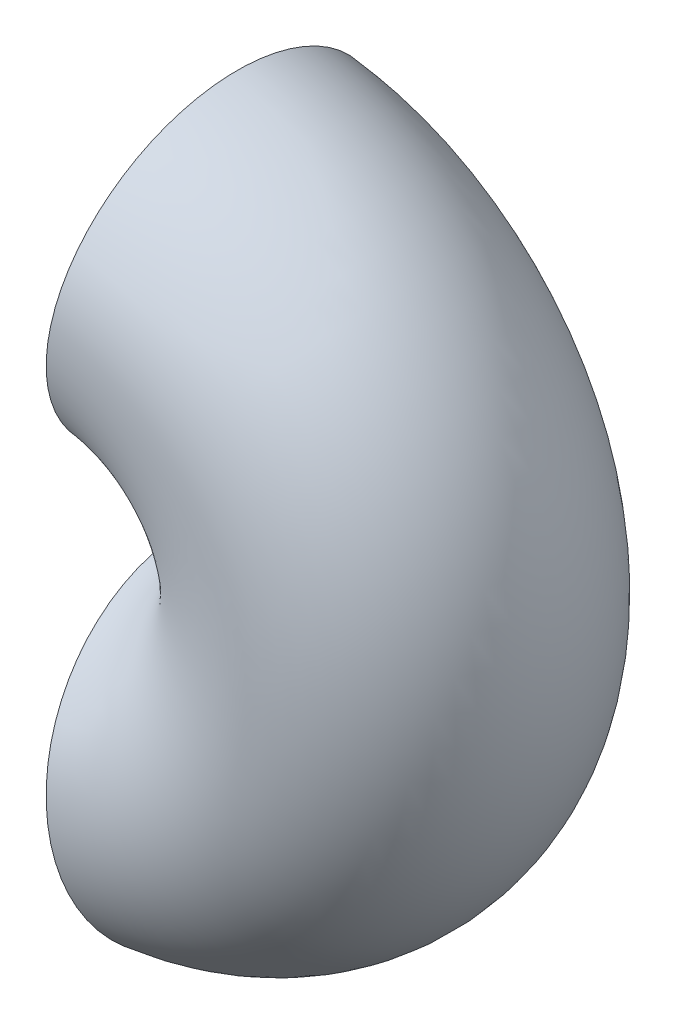
ISO-10303-21;
HEADER;
FILE_DESCRIPTION(('STEP AP214'),'2;1');
FILE_NAME('part.step','',(''),(''),'','','');
FILE_SCHEMA(('AUTOMOTIVE_DESIGN { 1 0 10303 214 1 1 1 1 }'));
ENDSEC;
DATA;
#1=APPLICATION_CONTEXT('core data for automotive mechanical design processes');
#2=APPLICATION_PROTOCOL_DEFINITION('international standard','automotive_design',2000,#1);
#3=PRODUCT_CONTEXT('',#1,'mechanical');
#4=PRODUCT('Part','Part','',(#3));
#5=PRODUCT_RELATED_PRODUCT_CATEGORY('part','',(#4));
#6=PRODUCT_DEFINITION_FORMATION('','',#4);
#7=PRODUCT_DEFINITION_CONTEXT('part definition',#1,'design');
#8=PRODUCT_DEFINITION('design','',#6,#7);
#9=PRODUCT_DEFINITION_SHAPE('','',#8);
#10=(LENGTH_UNIT() NAMED_UNIT(*) SI_UNIT(.MILLI.,.METRE.));
#11=(NAMED_UNIT(*) PLANE_ANGLE_UNIT() SI_UNIT($,.RADIAN.));
#12=(NAMED_UNIT(*) SI_UNIT($,.STERADIAN.) SOLID_ANGLE_UNIT());
#13=UNCERTAINTY_MEASURE_WITH_UNIT(LENGTH_MEASURE(1.E-05),#10,'distance_accuracy_value','');
#14=(GEOMETRIC_REPRESENTATION_CONTEXT(3) GLOBAL_UNCERTAINTY_ASSIGNED_CONTEXT((#13)) GLOBAL_UNIT_ASSIGNED_CONTEXT((#10,
#11,#12)) REPRESENTATION_CONTEXT('',''));
#15=CARTESIAN_POINT('',(0.,0.,0.));
#16=DIRECTION('',(0.,0.,1.));
#17=DIRECTION('',(1.,0.,0.));
#18=AXIS2_PLACEMENT_3D('',#15,#16,#17);
#19=CARTESIAN_POINT('',(-70.,0.,0.));
#20=DIRECTION('',(0.,0.,1.));
#21=DIRECTION('',(1.,0.,0.));
#22=AXIS2_PLACEMENT_3D('',#19,#20,#21);
#23=TOROIDAL_SURFACE('',#22,70.,54.9999999999999);
#24=CARTESIAN_POINT('',(-60.0777871920562,-69.2932153460487,0.));
#25=DIRECTION('',(-0.989903076372124,-0.141745897256341,0.));
#26=DIRECTION('',(0.,0.,-1.));
#27=AXIS2_PLACEMENT_3D('',#24,#25,#26);
#28=CIRCLE('',#27,54.9999999999999);
#29=CARTESIAN_POINT('',(-60.0777871920562,-69.2932153460487,-54.9999999999999));
#30=VERTEX_POINT('',#29);
#31=EDGE_CURVE('E96',#30,#30,#28,.T.);
#32=ORIENTED_EDGE('',*,*,#31,.F.);
#33=EDGE_LOOP('',(#32));
#34=FACE_BOUND('',#33,.T.);
#35=CARTESIAN_POINT('',(-60.0777871920562,69.2932153460487,0.));
#36=DIRECTION('',(0.989903076372124,-0.14174589725634,0.));
#37=DIRECTION('',(0.,0.,-1.));
#38=AXIS2_PLACEMENT_3D('',#35,#36,#37);
#39=CIRCLE('',#38,54.9999999999999);
#40=CARTESIAN_POINT('',(-60.0777871920562,69.2932153460487,-54.9999999999999));
#41=VERTEX_POINT('',#40);
#42=EDGE_CURVE('E12',#41,#41,#39,.T.);
#43=ORIENTED_EDGE('',*,*,#42,.T.);
#44=EDGE_LOOP('',(#43));
#45=FACE_BOUND('',#44,.T.);
#46=ADVANCED_FACE('F83',(#34,#45),#23,.T.);
#47=CARTESIAN_POINT('',(-70.,0.,0.));
#48=DIRECTION('',(0.,0.,1.));
#49=DIRECTION('',(1.,0.,0.));
#50=AXIS2_PLACEMENT_3D('',#47,#48,#49);
#51=TOROIDAL_SURFACE('',#50,70.,44.9999999999999);
#52=CARTESIAN_POINT('',(-60.0777871920562,-69.2932153460487,0.));
#53=DIRECTION('',(-0.989903076372124,-0.141745897256341,0.));
#54=DIRECTION('',(0.,0.,-1.));
#55=AXIS2_PLACEMENT_3D('',#52,#53,#54);
#56=CIRCLE('',#55,44.9999999999999);
#57=CARTESIAN_POINT('',(-60.0777871920562,-69.2932153460487,-44.9999999999999));
#58=VERTEX_POINT('',#57);
#59=EDGE_CURVE('E91',#58,#58,#56,.T.);
#60=ORIENTED_EDGE('',*,*,#59,.T.);
#61=EDGE_LOOP('',(#60));
#62=FACE_BOUND('',#61,.T.);
#63=CARTESIAN_POINT('',(-60.0777871920562,69.2932153460487,0.));
#64=DIRECTION('',(0.989903076372124,-0.14174589725634,0.));
#65=DIRECTION('',(0.,0.,-1.));
#66=AXIS2_PLACEMENT_3D('',#63,#64,#65);
#67=CIRCLE('',#66,44.9999999999999);
#68=CARTESIAN_POINT('',(-60.0777871920562,69.2932153460487,-44.9999999999998));
#69=VERTEX_POINT('',#68);
#70=EDGE_CURVE('E103',#69,#69,#67,.T.);
#71=ORIENTED_EDGE('',*,*,#70,.F.);
#72=EDGE_LOOP('',(#71));
#73=FACE_BOUND('',#72,.T.);
#74=ADVANCED_FACE('F116',(#62,#73),#51,.F.);
#75=CARTESIAN_POINT('',(-53.6992218155209,-113.838853782794,0.));
#76=DIRECTION('',(-0.989903076372124,-0.141745897256341,0.));
#77=DIRECTION('',(0.,0.,-1.));
#78=AXIS2_PLACEMENT_3D('',#75,#76,#77);
#79=PLANE('',#78);
#80=ORIENTED_EDGE('',*,*,#31,.T.);
#81=EDGE_LOOP('',(#80));
#82=FACE_BOUND('',#81,.T.);
#83=ORIENTED_EDGE('',*,*,#59,.F.);
#84=EDGE_LOOP('',(#83));
#85=FACE_BOUND('',#84,.T.);
#86=ADVANCED_FACE('F112',(#82,#85),#79,.T.);
#87=CARTESIAN_POINT('',(-53.6992218155209,113.838853782794,0.));
#88=DIRECTION('',(-0.989903076372124,0.14174589725634,0.));
#89=DIRECTION('',(0.,0.,1.));
#90=AXIS2_PLACEMENT_3D('',#87,#88,#89);
#91=PLANE('',#90);
#92=ORIENTED_EDGE('',*,*,#70,.T.);
#93=EDGE_LOOP('',(#92));
#94=FACE_BOUND('',#93,.T.);
#95=ORIENTED_EDGE('',*,*,#42,.F.);
#96=EDGE_LOOP('',(#95));
#97=FACE_BOUND('',#96,.T.);
#98=ADVANCED_FACE('F85',(#94,#97),#91,.T.);
#99=CLOSED_SHELL('',(#46,#74,#86,#98));
#100=MANIFOLD_SOLID_BREP('B2',#99);
#101=ADVANCED_BREP_SHAPE_REPRESENTATION('',(#18,#100),#14);
#102=SHAPE_DEFINITION_REPRESENTATION(#9,#101);
ENDSEC;
END-ISO-10303-21;
